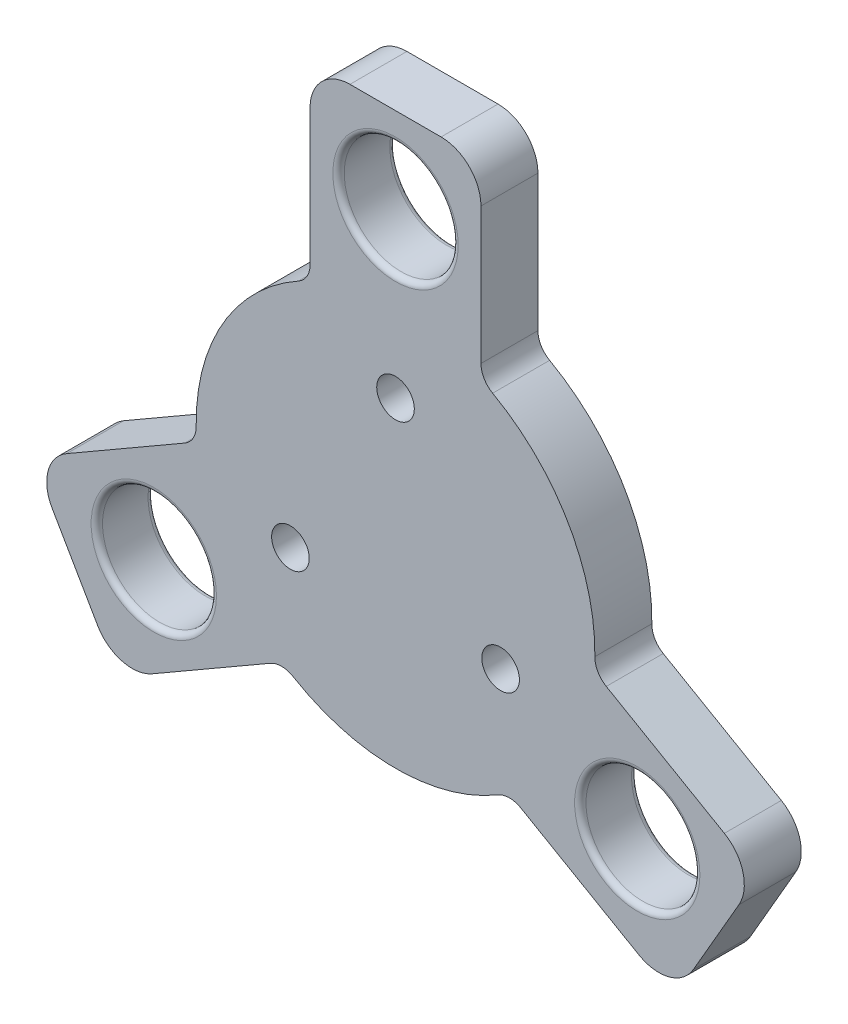
ISO-10303-21;
HEADER;
FILE_DESCRIPTION(('STEP AP214'),'2;1');
FILE_NAME('part.step','',(''),(''),'','','');
FILE_SCHEMA(('AUTOMOTIVE_DESIGN { 1 0 10303 214 1 1 1 1 }'));
ENDSEC;
DATA;
#1=APPLICATION_CONTEXT('core data for automotive mechanical design processes');
#2=APPLICATION_PROTOCOL_DEFINITION('international standard','automotive_design',2000,#1);
#3=PRODUCT_CONTEXT('',#1,'mechanical');
#4=PRODUCT('Part','Part','',(#3));
#5=PRODUCT_RELATED_PRODUCT_CATEGORY('part','',(#4));
#6=PRODUCT_DEFINITION_FORMATION('','',#4);
#7=PRODUCT_DEFINITION_CONTEXT('part definition',#1,'design');
#8=PRODUCT_DEFINITION('design','',#6,#7);
#9=PRODUCT_DEFINITION_SHAPE('','',#8);
#10=(LENGTH_UNIT() NAMED_UNIT(*) SI_UNIT(.MILLI.,.METRE.));
#11=(NAMED_UNIT(*) PLANE_ANGLE_UNIT() SI_UNIT($,.RADIAN.));
#12=(NAMED_UNIT(*) SI_UNIT($,.STERADIAN.) SOLID_ANGLE_UNIT());
#13=UNCERTAINTY_MEASURE_WITH_UNIT(LENGTH_MEASURE(1.E-05),#10,'distance_accuracy_value','');
#14=(GEOMETRIC_REPRESENTATION_CONTEXT(3) GLOBAL_UNCERTAINTY_ASSIGNED_CONTEXT((#13)) GLOBAL_UNIT_ASSIGNED_CONTEXT((#10,
#11,#12)) REPRESENTATION_CONTEXT('',''));
#15=CARTESIAN_POINT('',(0.,0.,0.));
#16=DIRECTION('',(0.,0.,1.));
#17=DIRECTION('',(1.,0.,0.));
#18=AXIS2_PLACEMENT_3D('',#15,#16,#17);
#19=CARTESIAN_POINT('',(3.75000000000002,-6.49519052838328,5.));
#20=DIRECTION('',(-0.500000000000002,0.866025403784437,0.));
#21=DIRECTION('',(-0.866025403784437,-0.500000000000002,0.));
#22=AXIS2_PLACEMENT_3D('',#19,#20,#21);
#23=PLANE('',#22);
#24=DIRECTION('',(0.866025403784437,0.500000000000002,0.));
#25=VECTOR('',#24,1.);
#26=CARTESIAN_POINT('',(3.75000000000002,-6.49519052838328,0.));
#27=LINE('',#26,#25);
#28=CARTESIAN_POINT('',(-21.3647367097487,-20.9951905283834,0.));
#29=VERTEX_POINT('',#28);
#30=CARTESIAN_POINT('',(-10.9978812037526,-15.0098837113465,0.));
#31=VERTEX_POINT('',#30);
#32=EDGE_CURVE('E858',#29,#31,#27,.T.);
#33=ORIENTED_EDGE('',*,*,#32,.T.);
#34=DIRECTION('',(0.,0.,1.));
#35=VECTOR('',#34,1.);
#36=CARTESIAN_POINT('',(-10.9978812037526,-15.0098837113465,5.));
#37=LINE('',#36,#35);
#38=CARTESIAN_POINT('',(-10.9978812037526,-15.0098837113465,5.));
#39=VERTEX_POINT('',#38);
#40=EDGE_CURVE('E352',#31,#39,#37,.T.);
#41=ORIENTED_EDGE('',*,*,#40,.T.);
#42=DIRECTION('',(0.866025403784437,0.500000000000002,0.));
#43=VECTOR('',#42,1.);
#44=CARTESIAN_POINT('',(3.75000000000002,-6.49519052838328,5.));
#45=LINE('',#44,#43);
#46=CARTESIAN_POINT('',(-21.3647367097487,-20.9951905283834,5.));
#47=VERTEX_POINT('',#46);
#48=EDGE_CURVE('E829',#47,#39,#45,.T.);
#49=ORIENTED_EDGE('',*,*,#48,.F.);
#50=DIRECTION('',(0.,0.,-1.));
#51=VECTOR('',#50,1.);
#52=CARTESIAN_POINT('',(-21.3647367097487,-20.9951905283834,5.));
#53=LINE('',#52,#51);
#54=EDGE_CURVE('E313',#47,#29,#53,.T.);
#55=ORIENTED_EDGE('',*,*,#54,.T.);
#56=EDGE_LOOP('',(#33,#41,#49,#55));
#57=FACE_BOUND('',#56,.T.);
#58=ADVANCED_FACE('F47',(#57),#23,.F.);
#59=CARTESIAN_POINT('',(0.,0.,5.));
#60=DIRECTION('',(0.,0.,-1.));
#61=DIRECTION('',(-1.,0.,0.));
#62=AXIS2_PLACEMENT_3D('',#59,#60,#61);
#63=CYLINDRICAL_SURFACE('',#62,17.5);
#64=CARTESIAN_POINT('',(0.,0.,5.));
#65=DIRECTION('',(0.,0.,1.));
#66=DIRECTION('',(1.,0.,0.));
#67=AXIS2_PLACEMENT_3D('',#64,#65,#66);
#68=CIRCLE('',#67,17.5);
#69=CARTESIAN_POINT('',(-8.97245749054719,-15.0248130297959,5.));
#70=VERTEX_POINT('',#69);
#71=CARTESIAN_POINT('',(8.97245749054727,-15.0248130297958,5.));
#72=VERTEX_POINT('',#71);
#73=EDGE_CURVE('E819',#70,#72,#68,.T.);
#74=ORIENTED_EDGE('',*,*,#73,.F.);
#75=DIRECTION('',(0.,0.,-1.));
#76=VECTOR('',#75,1.);
#77=CARTESIAN_POINT('',(-8.97245749054719,-15.0248130297959,5.));
#78=LINE('',#77,#76);
#79=CARTESIAN_POINT('',(-8.97245749054719,-15.0248130297959,0.));
#80=VERTEX_POINT('',#79);
#81=EDGE_CURVE('E348',#70,#80,#78,.T.);
#82=ORIENTED_EDGE('',*,*,#81,.T.);
#83=CARTESIAN_POINT('',(0.,0.,0.));
#84=DIRECTION('',(0.,0.,1.));
#85=DIRECTION('',(1.,0.,0.));
#86=AXIS2_PLACEMENT_3D('',#83,#84,#85);
#87=CIRCLE('',#86,17.5);
#88=CARTESIAN_POINT('',(8.97245749054727,-15.0248130297958,0.));
#89=VERTEX_POINT('',#88);
#90=EDGE_CURVE('E825',#80,#89,#87,.T.);
#91=ORIENTED_EDGE('',*,*,#90,.T.);
#92=DIRECTION('',(0.,0.,-1.));
#93=VECTOR('',#92,1.);
#94=CARTESIAN_POINT('',(8.97245749054727,-15.0248130297958,5.));
#95=LINE('',#94,#93);
#96=EDGE_CURVE('E345',#89,#72,#95,.F.);
#97=ORIENTED_EDGE('',*,*,#96,.T.);
#98=EDGE_LOOP('',(#74,#82,#91,#97));
#99=FACE_BOUND('',#98,.T.);
#100=ADVANCED_FACE('F462',(#99),#63,.T.);
#101=CARTESIAN_POINT('',(-3.74999999999999,-6.49519052838331,5.));
#102=DIRECTION('',(-0.499999999999998,-0.86602540378444,0.));
#103=DIRECTION('',(0.86602540378444,-0.499999999999998,0.));
#104=AXIS2_PLACEMENT_3D('',#101,#102,#103);
#105=PLANE('',#104);
#106=DIRECTION('',(-0.86602540378444,0.499999999999998,0.));
#107=VECTOR('',#106,1.);
#108=CARTESIAN_POINT('',(-3.74999999999999,-6.49519052838331,5.));
#109=LINE('',#108,#107);
#110=CARTESIAN_POINT('',(21.3647367097488,-20.9951905283832,5.));
#111=VERTEX_POINT('',#110);
#112=CARTESIAN_POINT('',(10.9978812037527,-15.0098837113465,5.));
#113=VERTEX_POINT('',#112);
#114=EDGE_CURVE('E812',#111,#113,#109,.T.);
#115=ORIENTED_EDGE('',*,*,#114,.T.);
#116=DIRECTION('',(0.,0.,-1.));
#117=VECTOR('',#116,1.);
#118=CARTESIAN_POINT('',(10.9978812037527,-15.0098837113465,5.));
#119=LINE('',#118,#117);
#120=CARTESIAN_POINT('',(10.9978812037527,-15.0098837113465,0.));
#121=VERTEX_POINT('',#120);
#122=EDGE_CURVE('E355',#113,#121,#119,.T.);
#123=ORIENTED_EDGE('',*,*,#122,.T.);
#124=DIRECTION('',(-0.86602540378444,0.499999999999998,0.));
#125=VECTOR('',#124,1.);
#126=CARTESIAN_POINT('',(-3.74999999999999,-6.49519052838331,0.));
#127=LINE('',#126,#125);
#128=CARTESIAN_POINT('',(21.3647367097488,-20.9951905283832,0.));
#129=VERTEX_POINT('',#128);
#130=EDGE_CURVE('E235',#129,#121,#127,.T.);
#131=ORIENTED_EDGE('',*,*,#130,.F.);
#132=DIRECTION('',(0.,0.,-1.));
#133=VECTOR('',#132,1.);
#134=CARTESIAN_POINT('',(21.3647367097488,-20.9951905283832,5.));
#135=LINE('',#134,#133);
#136=EDGE_CURVE('E266',#129,#111,#135,.F.);
#137=ORIENTED_EDGE('',*,*,#136,.T.);
#138=EDGE_LOOP('',(#115,#123,#131,#137));
#139=FACE_BOUND('',#138,.T.);
#140=ADVANCED_FACE('F469',(#139),#105,.T.);
#141=CARTESIAN_POINT('',(28.1458256229943,-16.2499999999999,5.));
#142=DIRECTION('',(0.86602540378444,-0.499999999999998,0.));
#143=DIRECTION('',(0.499999999999998,0.86602540378444,0.));
#144=AXIS2_PLACEMENT_3D('',#141,#142,#143);
#145=PLANE('',#144);
#146=DIRECTION('',(-0.499999999999998,-0.86602540378444,0.));
#147=VECTOR('',#146,1.);
#148=CARTESIAN_POINT('',(28.1458256229943,-16.2499999999999,5.));
#149=LINE('',#148,#147);
#150=CARTESIAN_POINT('',(30.1458256229943,-12.7858983848622,5.));
#151=VERTEX_POINT('',#150);
#152=CARTESIAN_POINT('',(26.1458256229943,-19.7141016151377,5.));
#153=VERTEX_POINT('',#152);
#154=EDGE_CURVE('E818',#151,#153,#149,.T.);
#155=ORIENTED_EDGE('',*,*,#154,.T.);
#156=DIRECTION('',(0.,0.,-1.));
#157=VECTOR('',#156,1.);
#158=CARTESIAN_POINT('',(26.1458256229943,-19.7141016151377,5.));
#159=LINE('',#158,#157);
#160=CARTESIAN_POINT('',(26.1458256229943,-19.7141016151377,0.));
#161=VERTEX_POINT('',#160);
#162=EDGE_CURVE('E233',#153,#161,#159,.T.);
#163=ORIENTED_EDGE('',*,*,#162,.T.);
#164=DIRECTION('',(-0.499999999999998,-0.86602540378444,0.));
#165=VECTOR('',#164,1.);
#166=CARTESIAN_POINT('',(28.1458256229943,-16.2499999999999,0.));
#167=LINE('',#166,#165);
#168=CARTESIAN_POINT('',(30.1458256229943,-12.7858983848622,0.));
#169=VERTEX_POINT('',#168);
#170=EDGE_CURVE('E215',#169,#161,#167,.T.);
#171=ORIENTED_EDGE('',*,*,#170,.F.);
#172=DIRECTION('',(0.,0.,-1.));
#173=VECTOR('',#172,1.);
#174=CARTESIAN_POINT('',(30.1458256229943,-12.7858983848622,5.));
#175=LINE('',#174,#173);
#176=EDGE_CURVE('E230',#169,#151,#175,.F.);
#177=ORIENTED_EDGE('',*,*,#176,.T.);
#178=EDGE_LOOP('',(#155,#163,#171,#177));
#179=FACE_BOUND('',#178,.T.);
#180=ADVANCED_FACE('F229',(#179),#145,.T.);
#181=CARTESIAN_POINT('',(3.75,6.49519052838331,5.));
#182=DIRECTION('',(-0.499999999999998,-0.86602540378444,0.));
#183=DIRECTION('',(0.86602540378444,-0.499999999999998,0.));
#184=AXIS2_PLACEMENT_3D('',#181,#182,#183);
#185=PLANE('',#184);
#186=DIRECTION('',(-0.86602540378444,0.499999999999998,0.));
#187=VECTOR('',#186,1.);
#188=CARTESIAN_POINT('',(3.75,6.49519052838331,0.));
#189=LINE('',#188,#187);
#190=CARTESIAN_POINT('',(28.8647367097487,-8.00480947161663,0.));
#191=VERTEX_POINT('',#190);
#192=CARTESIAN_POINT('',(18.4978812037526,-2.01950265457985,0.));
#193=VERTEX_POINT('',#192);
#194=EDGE_CURVE('E217',#191,#193,#189,.T.);
#195=ORIENTED_EDGE('',*,*,#194,.T.);
#196=DIRECTION('',(0.,0.,1.));
#197=VECTOR('',#196,1.);
#198=CARTESIAN_POINT('',(18.4978812037526,-2.01950265457985,5.));
#199=LINE('',#198,#197);
#200=CARTESIAN_POINT('',(18.4978812037526,-2.01950265457985,5.));
#201=VERTEX_POINT('',#200);
#202=EDGE_CURVE('E338',#193,#201,#199,.T.);
#203=ORIENTED_EDGE('',*,*,#202,.T.);
#204=DIRECTION('',(-0.86602540378444,0.499999999999998,0.));
#205=VECTOR('',#204,1.);
#206=CARTESIAN_POINT('',(3.75,6.49519052838331,5.));
#207=LINE('',#206,#205);
#208=CARTESIAN_POINT('',(28.8647367097487,-8.00480947161663,5.));
#209=VERTEX_POINT('',#208);
#210=EDGE_CURVE('E838',#209,#201,#207,.T.);
#211=ORIENTED_EDGE('',*,*,#210,.F.);
#212=DIRECTION('',(0.,0.,-1.));
#213=VECTOR('',#212,1.);
#214=CARTESIAN_POINT('',(28.8647367097487,-8.00480947161663,0.));
#215=LINE('',#214,#213);
#216=EDGE_CURVE('E286',#209,#191,#215,.T.);
#217=ORIENTED_EDGE('',*,*,#216,.T.);
#218=EDGE_LOOP('',(#195,#203,#211,#217));
#219=FACE_BOUND('',#218,.T.);
#220=ADVANCED_FACE('F763',(#219),#185,.F.);
#221=CARTESIAN_POINT('',(17.4980985161883,-0.2579696062919,5.));
#222=VERTEX_POINT('',#221);
#223=CARTESIAN_POINT('',(8.52564102564103,15.2827826360878,5.));
#224=VERTEX_POINT('',#223);
#225=EDGE_CURVE('E831',#222,#224,#68,.T.);
#226=ORIENTED_EDGE('',*,*,#225,.F.);
#227=DIRECTION('',(0.,0.,-1.));
#228=VECTOR('',#227,1.);
#229=CARTESIAN_POINT('',(17.4980985161883,-0.2579696062919,5.));
#230=LINE('',#229,#228);
#231=CARTESIAN_POINT('',(17.4980985161883,-0.2579696062919,0.));
#232=VERTEX_POINT('',#231);
#233=EDGE_CURVE('E334',#222,#232,#230,.T.);
#234=ORIENTED_EDGE('',*,*,#233,.T.);
#235=CARTESIAN_POINT('',(8.52564102564103,15.2827826360878,0.));
#236=VERTEX_POINT('',#235);
#237=EDGE_CURVE('E864',#232,#236,#87,.T.);
#238=ORIENTED_EDGE('',*,*,#237,.T.);
#239=DIRECTION('',(0.,0.,-1.));
#240=VECTOR('',#239,1.);
#241=CARTESIAN_POINT('',(8.52564102564103,15.2827826360878,5.));
#242=LINE('',#241,#240);
#243=EDGE_CURVE('E331',#236,#224,#242,.F.);
#244=ORIENTED_EDGE('',*,*,#243,.T.);
#245=EDGE_LOOP('',(#226,#234,#238,#244));
#246=FACE_BOUND('',#245,.T.);
#247=ADVANCED_FACE('F472',(#246),#63,.T.);
#248=CARTESIAN_POINT('',(7.5,0.,5.));
#249=DIRECTION('',(1.,0.,0.));
#250=DIRECTION('',(0.,1.,0.));
#251=AXIS2_PLACEMENT_3D('',#248,#249,#250);
#252=PLANE('',#251);
#253=DIRECTION('',(0.,-1.,0.));
#254=VECTOR('',#253,1.);
#255=CARTESIAN_POINT('',(7.5,0.,5.));
#256=LINE('',#255,#254);
#257=CARTESIAN_POINT('',(7.5,29.,5.));
#258=VERTEX_POINT('',#257);
#259=CARTESIAN_POINT('',(7.5,17.0293863659264,5.));
#260=VERTEX_POINT('',#259);
#261=EDGE_CURVE('E837',#258,#260,#256,.T.);
#262=ORIENTED_EDGE('',*,*,#261,.T.);
#263=DIRECTION('',(0.,0.,-1.));
#264=VECTOR('',#263,1.);
#265=CARTESIAN_POINT('',(7.5,17.0293863659264,5.));
#266=LINE('',#265,#264);
#267=CARTESIAN_POINT('',(7.5,17.0293863659264,0.));
#268=VERTEX_POINT('',#267);
#269=EDGE_CURVE('E341',#260,#268,#266,.T.);
#270=ORIENTED_EDGE('',*,*,#269,.T.);
#271=DIRECTION('',(0.,-1.,0.));
#272=VECTOR('',#271,1.);
#273=CARTESIAN_POINT('',(7.5,0.,0.));
#274=LINE('',#273,#272);
#275=CARTESIAN_POINT('',(7.5,29.,0.));
#276=VERTEX_POINT('',#275);
#277=EDGE_CURVE('E870',#276,#268,#274,.T.);
#278=ORIENTED_EDGE('',*,*,#277,.F.);
#279=DIRECTION('',(0.,0.,-1.));
#280=VECTOR('',#279,1.);
#281=CARTESIAN_POINT('',(7.5,29.,5.));
#282=LINE('',#281,#280);
#283=EDGE_CURVE('E296',#276,#258,#282,.F.);
#284=ORIENTED_EDGE('',*,*,#283,.T.);
#285=EDGE_LOOP('',(#262,#270,#278,#284));
#286=FACE_BOUND('',#285,.T.);
#287=ADVANCED_FACE('F746',(#286),#252,.T.);
#288=CARTESIAN_POINT('',(0.,32.5,5.));
#289=DIRECTION('',(0.,1.,0.));
#290=DIRECTION('',(0.,0.,1.));
#291=AXIS2_PLACEMENT_3D('',#288,#289,#290);
#292=PLANE('',#291);
#293=DIRECTION('',(1.,0.,0.));
#294=VECTOR('',#293,1.);
#295=CARTESIAN_POINT('',(0.,32.5,5.));
#296=LINE('',#295,#294);
#297=CARTESIAN_POINT('',(-4.,32.5,5.));
#298=VERTEX_POINT('',#297);
#299=CARTESIAN_POINT('',(4.,32.5,5.));
#300=VERTEX_POINT('',#299);
#301=EDGE_CURVE('E849',#298,#300,#296,.T.);
#302=ORIENTED_EDGE('',*,*,#301,.T.);
#303=DIRECTION('',(0.,0.,-1.));
#304=VECTOR('',#303,1.);
#305=CARTESIAN_POINT('',(4.,32.5,5.));
#306=LINE('',#305,#304);
#307=CARTESIAN_POINT('',(4.,32.5,0.));
#308=VERTEX_POINT('',#307);
#309=EDGE_CURVE('E292',#300,#308,#306,.T.);
#310=ORIENTED_EDGE('',*,*,#309,.T.);
#311=DIRECTION('',(1.,0.,0.));
#312=VECTOR('',#311,1.);
#313=CARTESIAN_POINT('',(0.,32.5,0.));
#314=LINE('',#313,#312);
#315=CARTESIAN_POINT('',(-4.,32.5,0.));
#316=VERTEX_POINT('',#315);
#317=EDGE_CURVE('E874',#316,#308,#314,.T.);
#318=ORIENTED_EDGE('',*,*,#317,.F.);
#319=DIRECTION('',(0.,0.,-1.));
#320=VECTOR('',#319,1.);
#321=CARTESIAN_POINT('',(-4.,32.5,5.));
#322=LINE('',#321,#320);
#323=EDGE_CURVE('E289',#316,#298,#322,.F.);
#324=ORIENTED_EDGE('',*,*,#323,.T.);
#325=EDGE_LOOP('',(#302,#310,#318,#324));
#326=FACE_BOUND('',#325,.T.);
#327=ADVANCED_FACE('F737',(#326),#292,.T.);
#328=CARTESIAN_POINT('',(-7.5,0.,5.));
#329=DIRECTION('',(1.,0.,0.));
#330=DIRECTION('',(0.,1.,0.));
#331=AXIS2_PLACEMENT_3D('',#328,#329,#330);
#332=PLANE('',#331);
#333=DIRECTION('',(0.,-1.,0.));
#334=VECTOR('',#333,1.);
#335=CARTESIAN_POINT('',(-7.5,0.,0.));
#336=LINE('',#335,#334);
#337=CARTESIAN_POINT('',(-7.5,29.,0.));
#338=VERTEX_POINT('',#337);
#339=CARTESIAN_POINT('',(-7.5,17.0293863659264,0.));
#340=VERTEX_POINT('',#339);
#341=EDGE_CURVE('E878',#338,#340,#336,.T.);
#342=ORIENTED_EDGE('',*,*,#341,.T.);
#343=DIRECTION('',(0.,0.,1.));
#344=VECTOR('',#343,1.);
#345=CARTESIAN_POINT('',(-7.5,17.0293863659264,5.));
#346=LINE('',#345,#344);
#347=CARTESIAN_POINT('',(-7.5,17.0293863659264,5.));
#348=VERTEX_POINT('',#347);
#349=EDGE_CURVE('E328',#340,#348,#346,.T.);
#350=ORIENTED_EDGE('',*,*,#349,.T.);
#351=DIRECTION('',(0.,-1.,0.));
#352=VECTOR('',#351,1.);
#353=CARTESIAN_POINT('',(-7.5,0.,5.));
#354=LINE('',#353,#352);
#355=CARTESIAN_POINT('',(-7.5,29.,5.));
#356=VERTEX_POINT('',#355);
#357=EDGE_CURVE('E841',#356,#348,#354,.T.);
#358=ORIENTED_EDGE('',*,*,#357,.F.);
#359=DIRECTION('',(0.,0.,-1.));
#360=VECTOR('',#359,1.);
#361=CARTESIAN_POINT('',(-7.5,29.,0.));
#362=LINE('',#361,#360);
#363=EDGE_CURVE('E299',#356,#338,#362,.T.);
#364=ORIENTED_EDGE('',*,*,#363,.T.);
#365=EDGE_LOOP('',(#342,#350,#358,#364));
#366=FACE_BOUND('',#365,.T.);
#367=ADVANCED_FACE('F729',(#366),#332,.F.);
#368=CARTESIAN_POINT('',(-8.52564102564103,15.2827826360878,0.));
#369=VERTEX_POINT('',#368);
#370=CARTESIAN_POINT('',(-17.4980985161883,-0.257969606292008,0.));
#371=VERTEX_POINT('',#370);
#372=EDGE_CURVE('E865',#369,#371,#87,.T.);
#373=ORIENTED_EDGE('',*,*,#372,.T.);
#374=DIRECTION('',(0.,0.,-1.));
#375=VECTOR('',#374,1.);
#376=CARTESIAN_POINT('',(-17.4980985161883,-0.257969606292008,5.));
#377=LINE('',#376,#375);
#378=CARTESIAN_POINT('',(-17.4980985161883,-0.257969606292008,5.));
#379=VERTEX_POINT('',#378);
#380=EDGE_CURVE('E325',#371,#379,#377,.F.);
#381=ORIENTED_EDGE('',*,*,#380,.T.);
#382=CARTESIAN_POINT('',(-8.52564102564103,15.2827826360878,5.));
#383=VERTEX_POINT('',#382);
#384=EDGE_CURVE('E832',#383,#379,#68,.T.);
#385=ORIENTED_EDGE('',*,*,#384,.F.);
#386=DIRECTION('',(0.,0.,-1.));
#387=VECTOR('',#386,1.);
#388=CARTESIAN_POINT('',(-8.52564102564103,15.2827826360878,5.));
#389=LINE('',#388,#387);
#390=EDGE_CURVE('E321',#383,#369,#389,.T.);
#391=ORIENTED_EDGE('',*,*,#390,.T.);
#392=EDGE_LOOP('',(#373,#381,#385,#391));
#393=FACE_BOUND('',#392,.T.);
#394=ADVANCED_FACE('F473',(#393),#63,.T.);
#395=CARTESIAN_POINT('',(-3.75000000000001,6.49519052838327,5.));
#396=DIRECTION('',(-0.500000000000002,0.866025403784437,0.));
#397=DIRECTION('',(-0.866025403784437,-0.500000000000002,0.));
#398=AXIS2_PLACEMENT_3D('',#395,#396,#397);
#399=PLANE('',#398);
#400=DIRECTION('',(0.866025403784438,0.500000000000002,0.));
#401=VECTOR('',#400,1.);
#402=CARTESIAN_POINT('',(-3.75000000000001,6.49519052838327,5.));
#403=LINE('',#402,#401);
#404=CARTESIAN_POINT('',(-28.8647367097487,-8.0048094716168,5.));
#405=VERTEX_POINT('',#404);
#406=CARTESIAN_POINT('',(-18.4978812037526,-2.01950265457997,5.));
#407=VERTEX_POINT('',#406);
#408=EDGE_CURVE('E248',#405,#407,#403,.T.);
#409=ORIENTED_EDGE('',*,*,#408,.T.);
#410=DIRECTION('',(0.,0.,-1.));
#411=VECTOR('',#410,1.);
#412=CARTESIAN_POINT('',(-18.4978812037526,-2.01950265457997,5.));
#413=LINE('',#412,#411);
#414=CARTESIAN_POINT('',(-18.4978812037526,-2.01950265457997,0.));
#415=VERTEX_POINT('',#414);
#416=EDGE_CURVE('E317',#407,#415,#413,.T.);
#417=ORIENTED_EDGE('',*,*,#416,.T.);
#418=DIRECTION('',(0.866025403784438,0.500000000000002,0.));
#419=VECTOR('',#418,1.);
#420=CARTESIAN_POINT('',(-3.75000000000001,6.49519052838327,0.));
#421=LINE('',#420,#419);
#422=CARTESIAN_POINT('',(-28.8647367097487,-8.0048094716168,0.));
#423=VERTEX_POINT('',#422);
#424=EDGE_CURVE('E881',#423,#415,#421,.T.);
#425=ORIENTED_EDGE('',*,*,#424,.F.);
#426=DIRECTION('',(0.,0.,-1.));
#427=VECTOR('',#426,1.);
#428=CARTESIAN_POINT('',(-28.8647367097487,-8.00480947161679,5.));
#429=LINE('',#428,#427);
#430=EDGE_CURVE('E310',#423,#405,#429,.F.);
#431=ORIENTED_EDGE('',*,*,#430,.T.);
#432=EDGE_LOOP('',(#409,#417,#425,#431));
#433=FACE_BOUND('',#432,.T.);
#434=ADVANCED_FACE('F713',(#433),#399,.T.);
#435=CARTESIAN_POINT('',(0.,25.,5.));
#436=DIRECTION('',(0.,0.,-1.));
#437=DIRECTION('',(-1.,0.,0.));
#438=AXIS2_PLACEMENT_3D('',#435,#436,#437);
#439=CYLINDRICAL_SURFACE('',#438,5.);
#440=CARTESIAN_POINT('',(0.,25.,0.5));
#441=DIRECTION('',(0.,0.,1.));
#442=DIRECTION('',(1.,0.,0.));
#443=AXIS2_PLACEMENT_3D('',#440,#441,#442);
#444=CIRCLE('',#443,5.);
#445=CARTESIAN_POINT('',(5.,25.,0.5));
#446=VERTEX_POINT('',#445);
#447=EDGE_CURVE('E424',#446,#446,#444,.F.);
#448=ORIENTED_EDGE('',*,*,#447,.T.);
#449=EDGE_LOOP('',(#448));
#450=FACE_BOUND('',#449,.T.);
#451=CARTESIAN_POINT('',(0.,25.,4.5));
#452=DIRECTION('',(0.,0.,1.));
#453=DIRECTION('',(1.,0.,0.));
#454=AXIS2_PLACEMENT_3D('',#451,#452,#453);
#455=CIRCLE('',#454,5.);
#456=CARTESIAN_POINT('',(5.,25.,4.5));
#457=VERTEX_POINT('',#456);
#458=EDGE_CURVE('E420',#457,#457,#455,.T.);
#459=ORIENTED_EDGE('',*,*,#458,.T.);
#460=EDGE_LOOP('',(#459));
#461=FACE_BOUND('',#460,.T.);
#462=ADVANCED_FACE('F704',(#450,#461),#439,.F.);
#463=CARTESIAN_POINT('',(-28.1458256229942,-16.2500000000001,5.));
#464=DIRECTION('',(0.866025403784437,0.500000000000002,0.));
#465=DIRECTION('',(-0.500000000000002,0.866025403784437,0.));
#466=AXIS2_PLACEMENT_3D('',#463,#464,#465);
#467=PLANE('',#466);
#468=DIRECTION('',(0.500000000000002,-0.866025403784437,0.));
#469=VECTOR('',#468,1.);
#470=CARTESIAN_POINT('',(-28.1458256229942,-16.2500000000001,5.));
#471=LINE('',#470,#469);
#472=CARTESIAN_POINT('',(-30.1458256229942,-12.7858983848623,5.));
#473=VERTEX_POINT('',#472);
#474=CARTESIAN_POINT('',(-26.1458256229942,-19.7141016151378,5.));
#475=VERTEX_POINT('',#474);
#476=EDGE_CURVE('E241',#473,#475,#471,.T.);
#477=ORIENTED_EDGE('',*,*,#476,.F.);
#478=DIRECTION('',(0.,0.,-1.));
#479=VECTOR('',#478,1.);
#480=CARTESIAN_POINT('',(-30.1458256229942,-12.7858983848623,0.));
#481=LINE('',#480,#479);
#482=CARTESIAN_POINT('',(-30.1458256229942,-12.7858983848623,0.));
#483=VERTEX_POINT('',#482);
#484=EDGE_CURVE('E306',#473,#483,#481,.T.);
#485=ORIENTED_EDGE('',*,*,#484,.T.);
#486=DIRECTION('',(0.500000000000002,-0.866025403784437,0.));
#487=VECTOR('',#486,1.);
#488=CARTESIAN_POINT('',(-28.1458256229942,-16.2500000000001,0.));
#489=LINE('',#488,#487);
#490=CARTESIAN_POINT('',(-26.1458256229942,-19.7141016151378,0.));
#491=VERTEX_POINT('',#490);
#492=EDGE_CURVE('E251',#483,#491,#489,.T.);
#493=ORIENTED_EDGE('',*,*,#492,.T.);
#494=DIRECTION('',(0.,0.,-1.));
#495=VECTOR('',#494,1.);
#496=CARTESIAN_POINT('',(-26.1458256229942,-19.7141016151378,5.));
#497=LINE('',#496,#495);
#498=EDGE_CURVE('E303',#491,#475,#497,.F.);
#499=ORIENTED_EDGE('',*,*,#498,.T.);
#500=EDGE_LOOP('',(#477,#485,#493,#499));
#501=FACE_BOUND('',#500,.T.);
#502=ADVANCED_FACE('F456',(#501),#467,.F.);
#503=CARTESIAN_POINT('',(-21.2176223927187,-12.2500000000001,5.));
#504=DIRECTION('',(0.,0.,-1.));
#505=DIRECTION('',(-1.,0.,0.));
#506=AXIS2_PLACEMENT_3D('',#503,#504,#505);
#507=CYLINDRICAL_SURFACE('',#506,5.);
#508=CARTESIAN_POINT('',(-21.2176223927187,-12.2500000000001,0.5));
#509=DIRECTION('',(0.,0.,1.));
#510=DIRECTION('',(1.,0.,0.));
#511=AXIS2_PLACEMENT_3D('',#508,#509,#510);
#512=CIRCLE('',#511,5.);
#513=CARTESIAN_POINT('',(-16.2176223927187,-12.2500000000001,0.5));
#514=VERTEX_POINT('',#513);
#515=EDGE_CURVE('E416',#514,#514,#512,.F.);
#516=ORIENTED_EDGE('',*,*,#515,.T.);
#517=EDGE_LOOP('',(#516));
#518=FACE_BOUND('',#517,.T.);
#519=CARTESIAN_POINT('',(-21.2176223927187,-12.2500000000001,4.5));
#520=DIRECTION('',(0.,0.,1.));
#521=DIRECTION('',(1.,0.,0.));
#522=AXIS2_PLACEMENT_3D('',#519,#520,#521);
#523=CIRCLE('',#522,5.);
#524=CARTESIAN_POINT('',(-16.2176223927187,-12.2500000000001,4.5));
#525=VERTEX_POINT('',#524);
#526=EDGE_CURVE('E412',#525,#525,#523,.T.);
#527=ORIENTED_EDGE('',*,*,#526,.T.);
#528=EDGE_LOOP('',(#527));
#529=FACE_BOUND('',#528,.T.);
#530=ADVANCED_FACE('F446',(#518,#529),#507,.F.);
#531=CARTESIAN_POINT('',(21.2176223927188,-12.2499999999999,5.));
#532=DIRECTION('',(0.,0.,-1.));
#533=DIRECTION('',(-1.,0.,0.));
#534=AXIS2_PLACEMENT_3D('',#531,#532,#533);
#535=CYLINDRICAL_SURFACE('',#534,5.);
#536=CARTESIAN_POINT('',(21.2176223927188,-12.2499999999999,0.5));
#537=DIRECTION('',(0.,0.,1.));
#538=DIRECTION('',(1.,0.,0.));
#539=AXIS2_PLACEMENT_3D('',#536,#537,#538);
#540=CIRCLE('',#539,5.);
#541=CARTESIAN_POINT('',(26.2176223927188,-12.2499999999999,0.5));
#542=VERTEX_POINT('',#541);
#543=EDGE_CURVE('E408',#542,#542,#540,.F.);
#544=ORIENTED_EDGE('',*,*,#543,.T.);
#545=EDGE_LOOP('',(#544));
#546=FACE_BOUND('',#545,.T.);
#547=CARTESIAN_POINT('',(21.2176223927188,-12.2499999999999,4.5));
#548=DIRECTION('',(0.,0.,1.));
#549=DIRECTION('',(1.,0.,0.));
#550=AXIS2_PLACEMENT_3D('',#547,#548,#549);
#551=CIRCLE('',#550,5.);
#552=CARTESIAN_POINT('',(26.2176223927188,-12.2499999999999,4.5));
#553=VERTEX_POINT('',#552);
#554=EDGE_CURVE('E404',#553,#553,#551,.T.);
#555=ORIENTED_EDGE('',*,*,#554,.T.);
#556=EDGE_LOOP('',(#555));
#557=FACE_BOUND('',#556,.T.);
#558=ADVANCED_FACE('F444',(#546,#557),#535,.F.);
#559=CARTESIAN_POINT('',(0.,0.,5.));
#560=DIRECTION('',(0.,0.,1.));
#561=DIRECTION('',(1.,0.,0.));
#562=AXIS2_PLACEMENT_3D('',#559,#560,#561);
#563=PLANE('',#562);
#564=CARTESIAN_POINT('',(9.22317055030428,-5.32499999999998,5.));
#565=DIRECTION('',(0.,0.,1.));
#566=DIRECTION('',(1.,0.,0.));
#567=AXIS2_PLACEMENT_3D('',#564,#565,#566);
#568=CIRCLE('',#567,1.65);
#569=CARTESIAN_POINT('',(10.8731705503043,-5.32499999999998,5.));
#570=VERTEX_POINT('',#569);
#571=EDGE_CURVE('E861',#570,#570,#568,.F.);
#572=ORIENTED_EDGE('',*,*,#571,.T.);
#573=EDGE_LOOP('',(#572));
#574=FACE_BOUND('',#573,.T.);
#575=CARTESIAN_POINT('',(-9.22317055030425,-5.32500000000004,5.));
#576=DIRECTION('',(0.,0.,1.));
#577=DIRECTION('',(1.,0.,0.));
#578=AXIS2_PLACEMENT_3D('',#575,#576,#577);
#579=CIRCLE('',#578,1.65000000000001);
#580=CARTESIAN_POINT('',(-7.57317055030424,-5.32500000000004,5.));
#581=VERTEX_POINT('',#580);
#582=EDGE_CURVE('E946',#581,#581,#579,.F.);
#583=ORIENTED_EDGE('',*,*,#582,.T.);
#584=EDGE_LOOP('',(#583));
#585=FACE_BOUND('',#584,.T.);
#586=CARTESIAN_POINT('',(0.,10.65,5.));
#587=DIRECTION('',(0.,0.,1.));
#588=DIRECTION('',(1.,0.,0.));
#589=AXIS2_PLACEMENT_3D('',#586,#587,#588);
#590=CIRCLE('',#589,1.65);
#591=CARTESIAN_POINT('',(1.65,10.65,5.));
#592=VERTEX_POINT('',#591);
#593=EDGE_CURVE('E954',#592,#592,#590,.F.);
#594=ORIENTED_EDGE('',*,*,#593,.T.);
#595=EDGE_LOOP('',(#594));
#596=FACE_BOUND('',#595,.T.);
#597=CARTESIAN_POINT('',(-21.2176223927187,-12.2500000000001,5.));
#598=DIRECTION('',(0.,0.,1.));
#599=DIRECTION('',(1.,0.,0.));
#600=AXIS2_PLACEMENT_3D('',#597,#598,#599);
#601=CIRCLE('',#600,5.50000000000001);
#602=CARTESIAN_POINT('',(-15.7176223927187,-12.2500000000001,5.));
#603=VERTEX_POINT('',#602);
#604=EDGE_CURVE('E11',#603,#603,#601,.F.);
#605=ORIENTED_EDGE('',*,*,#604,.T.);
#606=EDGE_LOOP('',(#605));
#607=FACE_BOUND('',#606,.T.);
#608=CARTESIAN_POINT('',(21.2176223927188,-12.2499999999999,5.));
#609=DIRECTION('',(0.,0.,1.));
#610=DIRECTION('',(1.,0.,0.));
#611=AXIS2_PLACEMENT_3D('',#608,#609,#610);
#612=CIRCLE('',#611,5.5);
#613=CARTESIAN_POINT('',(26.7176223927188,-12.2499999999999,5.));
#614=VERTEX_POINT('',#613);
#615=EDGE_CURVE('E56',#614,#614,#612,.F.);
#616=ORIENTED_EDGE('',*,*,#615,.T.);
#617=EDGE_LOOP('',(#616));
#618=FACE_BOUND('',#617,.T.);
#619=CARTESIAN_POINT('',(0.,25.,5.));
#620=DIRECTION('',(0.,0.,1.));
#621=DIRECTION('',(1.,0.,0.));
#622=AXIS2_PLACEMENT_3D('',#619,#620,#621);
#623=CIRCLE('',#622,5.5);
#624=CARTESIAN_POINT('',(5.5,25.,5.));
#625=VERTEX_POINT('',#624);
#626=EDGE_CURVE('E428',#625,#625,#623,.F.);
#627=ORIENTED_EDGE('',*,*,#626,.T.);
#628=EDGE_LOOP('',(#627));
#629=FACE_BOUND('',#628,.T.);
#630=ORIENTED_EDGE('',*,*,#114,.F.);
#631=CARTESIAN_POINT('',(23.1147367097488,-17.9641016151377,5.));
#632=DIRECTION('',(0.,0.,1.));
#633=DIRECTION('',(1.,0.,0.));
#634=AXIS2_PLACEMENT_3D('',#631,#632,#633);
#635=CIRCLE('',#634,3.5);
#636=EDGE_CURVE('E283',#111,#153,#635,.T.);
#637=ORIENTED_EDGE('',*,*,#636,.T.);
#638=ORIENTED_EDGE('',*,*,#154,.F.);
#639=CARTESIAN_POINT('',(27.1147367097487,-11.0358983848622,5.));
#640=DIRECTION('',(0.,0.,1.));
#641=DIRECTION('',(1.,0.,0.));
#642=AXIS2_PLACEMENT_3D('',#639,#640,#641);
#643=CIRCLE('',#642,3.5);
#644=EDGE_CURVE('E239',#151,#209,#643,.T.);
#645=ORIENTED_EDGE('',*,*,#644,.T.);
#646=ORIENTED_EDGE('',*,*,#210,.T.);
#647=CARTESIAN_POINT('',(19.4978812037526,-0.287451847010975,5.));
#648=DIRECTION('',(0.,0.,1.));
#649=DIRECTION('',(1.,0.,0.));
#650=AXIS2_PLACEMENT_3D('',#647,#648,#649);
#651=CIRCLE('',#650,2.);
#652=EDGE_CURVE('E373',#201,#222,#651,.F.);
#653=ORIENTED_EDGE('',*,*,#652,.T.);
#654=ORIENTED_EDGE('',*,*,#225,.T.);
#655=CARTESIAN_POINT('',(9.5,17.0293863659264,5.));
#656=DIRECTION('',(0.,0.,1.));
#657=DIRECTION('',(1.,0.,0.));
#658=AXIS2_PLACEMENT_3D('',#655,#656,#657);
#659=CIRCLE('',#658,2.);
#660=EDGE_CURVE('E379',#224,#260,#659,.F.);
#661=ORIENTED_EDGE('',*,*,#660,.T.);
#662=ORIENTED_EDGE('',*,*,#261,.F.);
#663=CARTESIAN_POINT('',(4.,29.,5.));
#664=DIRECTION('',(0.,0.,1.));
#665=DIRECTION('',(1.,0.,0.));
#666=AXIS2_PLACEMENT_3D('',#663,#664,#665);
#667=CIRCLE('',#666,3.5);
#668=EDGE_CURVE('E278',#258,#300,#667,.T.);
#669=ORIENTED_EDGE('',*,*,#668,.T.);
#670=ORIENTED_EDGE('',*,*,#301,.F.);
#671=CARTESIAN_POINT('',(-4.,29.,5.));
#672=DIRECTION('',(0.,0.,1.));
#673=DIRECTION('',(1.,0.,0.));
#674=AXIS2_PLACEMENT_3D('',#671,#672,#673);
#675=CIRCLE('',#674,3.5);
#676=EDGE_CURVE('E275',#298,#356,#675,.T.);
#677=ORIENTED_EDGE('',*,*,#676,.T.);
#678=ORIENTED_EDGE('',*,*,#357,.T.);
#679=CARTESIAN_POINT('',(-9.5,17.0293863659264,5.));
#680=DIRECTION('',(0.,0.,1.));
#681=DIRECTION('',(1.,0.,0.));
#682=AXIS2_PLACEMENT_3D('',#679,#680,#681);
#683=CIRCLE('',#682,2.);
#684=EDGE_CURVE('E367',#348,#383,#683,.F.);
#685=ORIENTED_EDGE('',*,*,#684,.T.);
#686=ORIENTED_EDGE('',*,*,#384,.T.);
#687=CARTESIAN_POINT('',(-19.4978812037526,-0.287451847011094,5.));
#688=DIRECTION('',(0.,0.,1.));
#689=DIRECTION('',(1.,0.,0.));
#690=AXIS2_PLACEMENT_3D('',#687,#688,#689);
#691=CIRCLE('',#690,2.);
#692=EDGE_CURVE('E361',#379,#407,#691,.F.);
#693=ORIENTED_EDGE('',*,*,#692,.T.);
#694=ORIENTED_EDGE('',*,*,#408,.F.);
#695=CARTESIAN_POINT('',(-27.1147367097487,-11.0358983848623,5.));
#696=DIRECTION('',(0.,0.,1.));
#697=DIRECTION('',(1.,0.,0.));
#698=AXIS2_PLACEMENT_3D('',#695,#696,#697);
#699=CIRCLE('',#698,3.5);
#700=EDGE_CURVE('E272',#405,#473,#699,.T.);
#701=ORIENTED_EDGE('',*,*,#700,.T.);
#702=ORIENTED_EDGE('',*,*,#476,.T.);
#703=CARTESIAN_POINT('',(-23.1147367097487,-17.9641016151378,5.));
#704=DIRECTION('',(0.,0.,1.));
#705=DIRECTION('',(1.,0.,0.));
#706=AXIS2_PLACEMENT_3D('',#703,#704,#705);
#707=CIRCLE('',#706,3.5);
#708=EDGE_CURVE('E269',#475,#47,#707,.T.);
#709=ORIENTED_EDGE('',*,*,#708,.T.);
#710=ORIENTED_EDGE('',*,*,#48,.T.);
#711=CARTESIAN_POINT('',(-9.99788120375258,-16.7419345189154,5.));
#712=DIRECTION('',(0.,0.,1.));
#713=DIRECTION('',(1.,0.,0.));
#714=AXIS2_PLACEMENT_3D('',#711,#712,#713);
#715=CIRCLE('',#714,2.);
#716=EDGE_CURVE('E385',#39,#70,#715,.F.);
#717=ORIENTED_EDGE('',*,*,#716,.T.);
#718=ORIENTED_EDGE('',*,*,#73,.T.);
#719=CARTESIAN_POINT('',(9.99788120375267,-16.7419345189153,5.));
#720=DIRECTION('',(0.,0.,1.));
#721=DIRECTION('',(1.,0.,0.));
#722=AXIS2_PLACEMENT_3D('',#719,#720,#721);
#723=CIRCLE('',#722,2.);
#724=EDGE_CURVE('E63',#72,#113,#723,.F.);
#725=ORIENTED_EDGE('',*,*,#724,.T.);
#726=EDGE_LOOP('',(#630,#637,#638,#645,#646,#653,#654,#661,#662,#669,#670,#677,#678,#685,#686,
#693,#694,#701,#702,#709,#710,#717,#718,#725));
#727=FACE_BOUND('',#726,.T.);
#728=ADVANCED_FACE('F435',(#574,#585,#596,#607,#618,#629,#727),#563,.T.);
#729=CARTESIAN_POINT('',(0.,0.,0.));
#730=DIRECTION('',(0.,0.,1.));
#731=DIRECTION('',(1.,0.,0.));
#732=AXIS2_PLACEMENT_3D('',#729,#730,#731);
#733=PLANE('',#732);
#734=CARTESIAN_POINT('',(9.22317055030428,-5.32499999999998,0.));
#735=DIRECTION('',(0.,0.,-1.));
#736=DIRECTION('',(-1.,0.,0.));
#737=AXIS2_PLACEMENT_3D('',#734,#735,#736);
#738=CIRCLE('',#737,1.65);
#739=CARTESIAN_POINT('',(7.57317055030428,-5.32499999999998,0.));
#740=VERTEX_POINT('',#739);
#741=EDGE_CURVE('E938',#740,#740,#738,.T.);
#742=ORIENTED_EDGE('',*,*,#741,.F.);
#743=EDGE_LOOP('',(#742));
#744=FACE_BOUND('',#743,.T.);
#745=CARTESIAN_POINT('',(-9.22317055030425,-5.32500000000004,0.));
#746=DIRECTION('',(0.,0.,-1.));
#747=DIRECTION('',(-1.,0.,0.));
#748=AXIS2_PLACEMENT_3D('',#745,#746,#747);
#749=CIRCLE('',#748,1.65000000000001);
#750=CARTESIAN_POINT('',(-10.8731705503043,-5.32500000000004,0.));
#751=VERTEX_POINT('',#750);
#752=EDGE_CURVE('E942',#751,#751,#749,.T.);
#753=ORIENTED_EDGE('',*,*,#752,.F.);
#754=EDGE_LOOP('',(#753));
#755=FACE_BOUND('',#754,.T.);
#756=CARTESIAN_POINT('',(0.,10.65,0.));
#757=DIRECTION('',(0.,0.,-1.));
#758=DIRECTION('',(-1.,0.,0.));
#759=AXIS2_PLACEMENT_3D('',#756,#757,#758);
#760=CIRCLE('',#759,1.65);
#761=CARTESIAN_POINT('',(-1.65,10.65,0.));
#762=VERTEX_POINT('',#761);
#763=EDGE_CURVE('E950',#762,#762,#760,.T.);
#764=ORIENTED_EDGE('',*,*,#763,.F.);
#765=EDGE_LOOP('',(#764));
#766=FACE_BOUND('',#765,.T.);
#767=CARTESIAN_POINT('',(21.2176223927188,-12.2499999999999,0.));
#768=DIRECTION('',(0.,0.,1.));
#769=DIRECTION('',(1.,0.,0.));
#770=AXIS2_PLACEMENT_3D('',#767,#768,#769);
#771=CIRCLE('',#770,5.5);
#772=CARTESIAN_POINT('',(26.7176223927188,-12.2499999999999,0.));
#773=VERTEX_POINT('',#772);
#774=EDGE_CURVE('E400',#773,#773,#771,.T.);
#775=ORIENTED_EDGE('',*,*,#774,.T.);
#776=EDGE_LOOP('',(#775));
#777=FACE_BOUND('',#776,.T.);
#778=CARTESIAN_POINT('',(-21.2176223927187,-12.2500000000001,0.));
#779=DIRECTION('',(0.,0.,1.));
#780=DIRECTION('',(1.,0.,0.));
#781=AXIS2_PLACEMENT_3D('',#778,#779,#780);
#782=CIRCLE('',#781,5.50000000000001);
#783=CARTESIAN_POINT('',(-15.7176223927187,-12.2500000000001,0.));
#784=VERTEX_POINT('',#783);
#785=EDGE_CURVE('E396',#784,#784,#782,.T.);
#786=ORIENTED_EDGE('',*,*,#785,.T.);
#787=EDGE_LOOP('',(#786));
#788=FACE_BOUND('',#787,.T.);
#789=CARTESIAN_POINT('',(0.,25.,0.));
#790=DIRECTION('',(0.,0.,1.));
#791=DIRECTION('',(1.,0.,0.));
#792=AXIS2_PLACEMENT_3D('',#789,#790,#791);
#793=CIRCLE('',#792,5.5);
#794=CARTESIAN_POINT('',(5.5,25.,0.));
#795=VERTEX_POINT('',#794);
#796=EDGE_CURVE('E392',#795,#795,#793,.T.);
#797=ORIENTED_EDGE('',*,*,#796,.T.);
#798=EDGE_LOOP('',(#797));
#799=FACE_BOUND('',#798,.T.);
#800=ORIENTED_EDGE('',*,*,#170,.T.);
#801=CARTESIAN_POINT('',(23.1147367097488,-17.9641016151377,0.));
#802=DIRECTION('',(0.,0.,1.));
#803=DIRECTION('',(1.,0.,0.));
#804=AXIS2_PLACEMENT_3D('',#801,#802,#803);
#805=CIRCLE('',#804,3.5);
#806=EDGE_CURVE('E223',#161,#129,#805,.F.);
#807=ORIENTED_EDGE('',*,*,#806,.T.);
#808=ORIENTED_EDGE('',*,*,#130,.T.);
#809=CARTESIAN_POINT('',(9.99788120375267,-16.7419345189153,0.));
#810=DIRECTION('',(0.,0.,1.));
#811=DIRECTION('',(1.,0.,0.));
#812=AXIS2_PLACEMENT_3D('',#809,#810,#811);
#813=CIRCLE('',#812,2.);
#814=EDGE_CURVE('E71',#121,#89,#813,.T.);
#815=ORIENTED_EDGE('',*,*,#814,.T.);
#816=ORIENTED_EDGE('',*,*,#90,.F.);
#817=CARTESIAN_POINT('',(-9.99788120375258,-16.7419345189154,0.));
#818=DIRECTION('',(0.,0.,1.));
#819=DIRECTION('',(1.,0.,0.));
#820=AXIS2_PLACEMENT_3D('',#817,#818,#819);
#821=CIRCLE('',#820,2.);
#822=EDGE_CURVE('E382',#80,#31,#821,.T.);
#823=ORIENTED_EDGE('',*,*,#822,.T.);
#824=ORIENTED_EDGE('',*,*,#32,.F.);
#825=CARTESIAN_POINT('',(-23.1147367097487,-17.9641016151378,0.));
#826=DIRECTION('',(0.,0.,1.));
#827=DIRECTION('',(1.,0.,0.));
#828=AXIS2_PLACEMENT_3D('',#825,#826,#827);
#829=CIRCLE('',#828,3.5);
#830=EDGE_CURVE('E245',#29,#491,#829,.F.);
#831=ORIENTED_EDGE('',*,*,#830,.T.);
#832=ORIENTED_EDGE('',*,*,#492,.F.);
#833=CARTESIAN_POINT('',(-27.1147367097487,-11.0358983848623,0.));
#834=DIRECTION('',(0.,0.,1.));
#835=DIRECTION('',(1.,0.,0.));
#836=AXIS2_PLACEMENT_3D('',#833,#834,#835);
#837=CIRCLE('',#836,3.5);
#838=EDGE_CURVE('E256',#483,#423,#837,.F.);
#839=ORIENTED_EDGE('',*,*,#838,.T.);
#840=ORIENTED_EDGE('',*,*,#424,.T.);
#841=CARTESIAN_POINT('',(-19.4978812037526,-0.287451847011094,0.));
#842=DIRECTION('',(0.,0.,1.));
#843=DIRECTION('',(1.,0.,0.));
#844=AXIS2_PLACEMENT_3D('',#841,#842,#843);
#845=CIRCLE('',#844,2.);
#846=EDGE_CURVE('E358',#415,#371,#845,.T.);
#847=ORIENTED_EDGE('',*,*,#846,.T.);
#848=ORIENTED_EDGE('',*,*,#372,.F.);
#849=CARTESIAN_POINT('',(-9.5,17.0293863659264,0.));
#850=DIRECTION('',(0.,0.,1.));
#851=DIRECTION('',(1.,0.,0.));
#852=AXIS2_PLACEMENT_3D('',#849,#850,#851);
#853=CIRCLE('',#852,2.);
#854=EDGE_CURVE('E364',#369,#340,#853,.T.);
#855=ORIENTED_EDGE('',*,*,#854,.T.);
#856=ORIENTED_EDGE('',*,*,#341,.F.);
#857=CARTESIAN_POINT('',(-4.,29.,0.));
#858=DIRECTION('',(0.,0.,1.));
#859=DIRECTION('',(1.,0.,0.));
#860=AXIS2_PLACEMENT_3D('',#857,#858,#859);
#861=CIRCLE('',#860,3.5);
#862=EDGE_CURVE('E259',#338,#316,#861,.F.);
#863=ORIENTED_EDGE('',*,*,#862,.T.);
#864=ORIENTED_EDGE('',*,*,#317,.T.);
#865=CARTESIAN_POINT('',(4.,29.,0.));
#866=DIRECTION('',(0.,0.,1.));
#867=DIRECTION('',(1.,0.,0.));
#868=AXIS2_PLACEMENT_3D('',#865,#866,#867);
#869=CIRCLE('',#868,3.5);
#870=EDGE_CURVE('E224',#308,#276,#869,.F.);
#871=ORIENTED_EDGE('',*,*,#870,.T.);
#872=ORIENTED_EDGE('',*,*,#277,.T.);
#873=CARTESIAN_POINT('',(9.5,17.0293863659264,0.));
#874=DIRECTION('',(0.,0.,1.));
#875=DIRECTION('',(1.,0.,0.));
#876=AXIS2_PLACEMENT_3D('',#873,#874,#875);
#877=CIRCLE('',#876,2.);
#878=EDGE_CURVE('E376',#268,#236,#877,.T.);
#879=ORIENTED_EDGE('',*,*,#878,.T.);
#880=ORIENTED_EDGE('',*,*,#237,.F.);
#881=CARTESIAN_POINT('',(19.4978812037526,-0.287451847010975,0.));
#882=DIRECTION('',(0.,0.,1.));
#883=DIRECTION('',(1.,0.,0.));
#884=AXIS2_PLACEMENT_3D('',#881,#882,#883);
#885=CIRCLE('',#884,2.);
#886=EDGE_CURVE('E370',#232,#193,#885,.T.);
#887=ORIENTED_EDGE('',*,*,#886,.T.);
#888=ORIENTED_EDGE('',*,*,#194,.F.);
#889=CARTESIAN_POINT('',(27.1147367097487,-11.0358983848622,0.));
#890=DIRECTION('',(0.,0.,1.));
#891=DIRECTION('',(1.,0.,0.));
#892=AXIS2_PLACEMENT_3D('',#889,#890,#891);
#893=CIRCLE('',#892,3.5);
#894=EDGE_CURVE('E212',#191,#169,#893,.F.);
#895=ORIENTED_EDGE('',*,*,#894,.T.);
#896=EDGE_LOOP('',(#800,#807,#808,#815,#816,#823,#824,#831,#832,#839,#840,#847,#848,#855,#856,
#863,#864,#871,#872,#879,#880,#887,#888,#895));
#897=FACE_BOUND('',#896,.T.);
#898=ADVANCED_FACE('F214',(#744,#755,#766,#777,#788,#799,#897),#733,.F.);
#899=CARTESIAN_POINT('',(23.1147367097488,-17.9641016151377,5.));
#900=DIRECTION('',(0.,0.,-1.));
#901=DIRECTION('',(-1.,0.,0.));
#902=AXIS2_PLACEMENT_3D('',#899,#900,#901);
#903=CYLINDRICAL_SURFACE('',#902,3.5);
#904=ORIENTED_EDGE('',*,*,#636,.F.);
#905=ORIENTED_EDGE('',*,*,#136,.F.);
#906=ORIENTED_EDGE('',*,*,#806,.F.);
#907=ORIENTED_EDGE('',*,*,#162,.F.);
#908=EDGE_LOOP('',(#904,#905,#906,#907));
#909=FACE_BOUND('',#908,.T.);
#910=ADVANCED_FACE('F478',(#909),#903,.T.);
#911=CARTESIAN_POINT('',(27.1147367097487,-11.0358983848622,5.));
#912=DIRECTION('',(0.,0.,1.));
#913=DIRECTION('',(1.,0.,0.));
#914=AXIS2_PLACEMENT_3D('',#911,#912,#913);
#915=CYLINDRICAL_SURFACE('',#914,3.5);
#916=ORIENTED_EDGE('',*,*,#644,.F.);
#917=ORIENTED_EDGE('',*,*,#176,.F.);
#918=ORIENTED_EDGE('',*,*,#894,.F.);
#919=ORIENTED_EDGE('',*,*,#216,.F.);
#920=EDGE_LOOP('',(#916,#917,#918,#919));
#921=FACE_BOUND('',#920,.T.);
#922=ADVANCED_FACE('F238',(#921),#915,.T.);
#923=CARTESIAN_POINT('',(4.,29.,5.));
#924=DIRECTION('',(0.,0.,-1.));
#925=DIRECTION('',(-1.,0.,0.));
#926=AXIS2_PLACEMENT_3D('',#923,#924,#925);
#927=CYLINDRICAL_SURFACE('',#926,3.5);
#928=ORIENTED_EDGE('',*,*,#668,.F.);
#929=ORIENTED_EDGE('',*,*,#283,.F.);
#930=ORIENTED_EDGE('',*,*,#870,.F.);
#931=ORIENTED_EDGE('',*,*,#309,.F.);
#932=EDGE_LOOP('',(#928,#929,#930,#931));
#933=FACE_BOUND('',#932,.T.);
#934=ADVANCED_FACE('F484',(#933),#927,.T.);
#935=CARTESIAN_POINT('',(-4.,29.,5.));
#936=DIRECTION('',(0.,0.,1.));
#937=DIRECTION('',(1.,0.,0.));
#938=AXIS2_PLACEMENT_3D('',#935,#936,#937);
#939=CYLINDRICAL_SURFACE('',#938,3.5);
#940=ORIENTED_EDGE('',*,*,#676,.F.);
#941=ORIENTED_EDGE('',*,*,#323,.F.);
#942=ORIENTED_EDGE('',*,*,#862,.F.);
#943=ORIENTED_EDGE('',*,*,#363,.F.);
#944=EDGE_LOOP('',(#940,#941,#942,#943));
#945=FACE_BOUND('',#944,.T.);
#946=ADVANCED_FACE('F487',(#945),#939,.T.);
#947=CARTESIAN_POINT('',(-27.1147367097487,-11.0358983848623,5.));
#948=DIRECTION('',(0.,0.,1.));
#949=DIRECTION('',(1.,0.,0.));
#950=AXIS2_PLACEMENT_3D('',#947,#948,#949);
#951=CYLINDRICAL_SURFACE('',#950,3.5);
#952=ORIENTED_EDGE('',*,*,#700,.F.);
#953=ORIENTED_EDGE('',*,*,#430,.F.);
#954=ORIENTED_EDGE('',*,*,#838,.F.);
#955=ORIENTED_EDGE('',*,*,#484,.F.);
#956=EDGE_LOOP('',(#952,#953,#954,#955));
#957=FACE_BOUND('',#956,.T.);
#958=ADVANCED_FACE('F491',(#957),#951,.T.);
#959=CARTESIAN_POINT('',(-23.1147367097487,-17.9641016151378,5.));
#960=DIRECTION('',(0.,0.,-1.));
#961=DIRECTION('',(-1.,0.,0.));
#962=AXIS2_PLACEMENT_3D('',#959,#960,#961);
#963=CYLINDRICAL_SURFACE('',#962,3.5);
#964=ORIENTED_EDGE('',*,*,#708,.F.);
#965=ORIENTED_EDGE('',*,*,#498,.F.);
#966=ORIENTED_EDGE('',*,*,#830,.F.);
#967=ORIENTED_EDGE('',*,*,#54,.F.);
#968=EDGE_LOOP('',(#964,#965,#966,#967));
#969=FACE_BOUND('',#968,.T.);
#970=ADVANCED_FACE('F495',(#969),#963,.T.);
#971=CARTESIAN_POINT('',(-19.4978812037526,-0.287451847011094,5.));
#972=DIRECTION('',(0.,0.,-1.));
#973=DIRECTION('',(-1.,0.,0.));
#974=AXIS2_PLACEMENT_3D('',#971,#972,#973);
#975=CYLINDRICAL_SURFACE('',#974,2.);
#976=ORIENTED_EDGE('',*,*,#692,.F.);
#977=ORIENTED_EDGE('',*,*,#380,.F.);
#978=ORIENTED_EDGE('',*,*,#846,.F.);
#979=ORIENTED_EDGE('',*,*,#416,.F.);
#980=EDGE_LOOP('',(#976,#977,#978,#979));
#981=FACE_BOUND('',#980,.T.);
#982=ADVANCED_FACE('F498',(#981),#975,.F.);
#983=CARTESIAN_POINT('',(-9.5,17.0293863659264,5.));
#984=DIRECTION('',(0.,0.,-1.));
#985=DIRECTION('',(-1.,0.,0.));
#986=AXIS2_PLACEMENT_3D('',#983,#984,#985);
#987=CYLINDRICAL_SURFACE('',#986,2.);
#988=ORIENTED_EDGE('',*,*,#684,.F.);
#989=ORIENTED_EDGE('',*,*,#349,.F.);
#990=ORIENTED_EDGE('',*,*,#854,.F.);
#991=ORIENTED_EDGE('',*,*,#390,.F.);
#992=EDGE_LOOP('',(#988,#989,#990,#991));
#993=FACE_BOUND('',#992,.T.);
#994=ADVANCED_FACE('F502',(#993),#987,.F.);
#995=CARTESIAN_POINT('',(19.4978812037526,-0.287451847010975,5.));
#996=DIRECTION('',(0.,0.,-1.));
#997=DIRECTION('',(-1.,0.,0.));
#998=AXIS2_PLACEMENT_3D('',#995,#996,#997);
#999=CYLINDRICAL_SURFACE('',#998,2.);
#1000=ORIENTED_EDGE('',*,*,#652,.F.);
#1001=ORIENTED_EDGE('',*,*,#202,.F.);
#1002=ORIENTED_EDGE('',*,*,#886,.F.);
#1003=ORIENTED_EDGE('',*,*,#233,.F.);
#1004=EDGE_LOOP('',(#1000,#1001,#1002,#1003));
#1005=FACE_BOUND('',#1004,.T.);
#1006=ADVANCED_FACE('F506',(#1005),#999,.F.);
#1007=CARTESIAN_POINT('',(9.5,17.0293863659264,5.));
#1008=DIRECTION('',(0.,0.,-1.));
#1009=DIRECTION('',(-1.,0.,0.));
#1010=AXIS2_PLACEMENT_3D('',#1007,#1008,#1009);
#1011=CYLINDRICAL_SURFACE('',#1010,2.);
#1012=ORIENTED_EDGE('',*,*,#660,.F.);
#1013=ORIENTED_EDGE('',*,*,#243,.F.);
#1014=ORIENTED_EDGE('',*,*,#878,.F.);
#1015=ORIENTED_EDGE('',*,*,#269,.F.);
#1016=EDGE_LOOP('',(#1012,#1013,#1014,#1015));
#1017=FACE_BOUND('',#1016,.T.);
#1018=ADVANCED_FACE('F510',(#1017),#1011,.F.);
#1019=CARTESIAN_POINT('',(-9.99788120375258,-16.7419345189154,5.));
#1020=DIRECTION('',(0.,0.,-1.));
#1021=DIRECTION('',(-1.,0.,0.));
#1022=AXIS2_PLACEMENT_3D('',#1019,#1020,#1021);
#1023=CYLINDRICAL_SURFACE('',#1022,2.);
#1024=ORIENTED_EDGE('',*,*,#716,.F.);
#1025=ORIENTED_EDGE('',*,*,#40,.F.);
#1026=ORIENTED_EDGE('',*,*,#822,.F.);
#1027=ORIENTED_EDGE('',*,*,#81,.F.);
#1028=EDGE_LOOP('',(#1024,#1025,#1026,#1027));
#1029=FACE_BOUND('',#1028,.T.);
#1030=ADVANCED_FACE('F514',(#1029),#1023,.F.);
#1031=CARTESIAN_POINT('',(9.99788120375267,-16.7419345189153,5.));
#1032=DIRECTION('',(0.,0.,-1.));
#1033=DIRECTION('',(-1.,0.,0.));
#1034=AXIS2_PLACEMENT_3D('',#1031,#1032,#1033);
#1035=CYLINDRICAL_SURFACE('',#1034,2.);
#1036=ORIENTED_EDGE('',*,*,#724,.F.);
#1037=ORIENTED_EDGE('',*,*,#96,.F.);
#1038=ORIENTED_EDGE('',*,*,#814,.F.);
#1039=ORIENTED_EDGE('',*,*,#122,.F.);
#1040=EDGE_LOOP('',(#1036,#1037,#1038,#1039));
#1041=FACE_BOUND('',#1040,.T.);
#1042=ADVANCED_FACE('F518',(#1041),#1035,.F.);
#1043=CARTESIAN_POINT('',(21.2176223927188,-12.2499999999999,0.5));
#1044=DIRECTION('',(0.,0.,1.));
#1045=DIRECTION('',(1.,0.,0.));
#1046=AXIS2_PLACEMENT_3D('',#1043,#1044,#1045);
#1047=TOROIDAL_SURFACE('',#1046,5.5,0.5);
#1048=ORIENTED_EDGE('',*,*,#543,.F.);
#1049=EDGE_LOOP('',(#1048));
#1050=FACE_BOUND('',#1049,.T.);
#1051=ORIENTED_EDGE('',*,*,#774,.F.);
#1052=EDGE_LOOP('',(#1051));
#1053=FACE_BOUND('',#1052,.T.);
#1054=ADVANCED_FACE('F522',(#1050,#1053),#1047,.T.);
#1055=CARTESIAN_POINT('',(-21.2176223927187,-12.2500000000001,0.5));
#1056=DIRECTION('',(0.,0.,1.));
#1057=DIRECTION('',(1.,0.,0.));
#1058=AXIS2_PLACEMENT_3D('',#1055,#1056,#1057);
#1059=TOROIDAL_SURFACE('',#1058,5.50000000000001,0.5);
#1060=ORIENTED_EDGE('',*,*,#515,.F.);
#1061=EDGE_LOOP('',(#1060));
#1062=FACE_BOUND('',#1061,.T.);
#1063=ORIENTED_EDGE('',*,*,#785,.F.);
#1064=EDGE_LOOP('',(#1063));
#1065=FACE_BOUND('',#1064,.T.);
#1066=ADVANCED_FACE('F524',(#1062,#1065),#1059,.T.);
#1067=CARTESIAN_POINT('',(0.,25.,0.5));
#1068=DIRECTION('',(0.,0.,1.));
#1069=DIRECTION('',(1.,0.,0.));
#1070=AXIS2_PLACEMENT_3D('',#1067,#1068,#1069);
#1071=TOROIDAL_SURFACE('',#1070,5.5,0.5);
#1072=ORIENTED_EDGE('',*,*,#447,.F.);
#1073=EDGE_LOOP('',(#1072));
#1074=FACE_BOUND('',#1073,.T.);
#1075=ORIENTED_EDGE('',*,*,#796,.F.);
#1076=EDGE_LOOP('',(#1075));
#1077=FACE_BOUND('',#1076,.T.);
#1078=ADVANCED_FACE('F528',(#1074,#1077),#1071,.T.);
#1079=CARTESIAN_POINT('',(-21.2176223927187,-12.2500000000001,4.5));
#1080=DIRECTION('',(0.,0.,1.));
#1081=DIRECTION('',(1.,0.,0.));
#1082=AXIS2_PLACEMENT_3D('',#1079,#1080,#1081);
#1083=TOROIDAL_SURFACE('',#1082,5.50000000000001,0.5);
#1084=ORIENTED_EDGE('',*,*,#604,.F.);
#1085=EDGE_LOOP('',(#1084));
#1086=FACE_BOUND('',#1085,.T.);
#1087=ORIENTED_EDGE('',*,*,#526,.F.);
#1088=EDGE_LOOP('',(#1087));
#1089=FACE_BOUND('',#1088,.T.);
#1090=ADVANCED_FACE('F441',(#1086,#1089),#1083,.T.);
#1091=CARTESIAN_POINT('',(21.2176223927188,-12.2499999999999,4.5));
#1092=DIRECTION('',(0.,0.,1.));
#1093=DIRECTION('',(1.,0.,0.));
#1094=AXIS2_PLACEMENT_3D('',#1091,#1092,#1093);
#1095=TOROIDAL_SURFACE('',#1094,5.5,0.5);
#1096=ORIENTED_EDGE('',*,*,#615,.F.);
#1097=EDGE_LOOP('',(#1096));
#1098=FACE_BOUND('',#1097,.T.);
#1099=ORIENTED_EDGE('',*,*,#554,.F.);
#1100=EDGE_LOOP('',(#1099));
#1101=FACE_BOUND('',#1100,.T.);
#1102=ADVANCED_FACE('F438',(#1098,#1101),#1095,.T.);
#1103=CARTESIAN_POINT('',(0.,25.,4.5));
#1104=DIRECTION('',(0.,0.,1.));
#1105=DIRECTION('',(1.,0.,0.));
#1106=AXIS2_PLACEMENT_3D('',#1103,#1104,#1105);
#1107=TOROIDAL_SURFACE('',#1106,5.5,0.5);
#1108=ORIENTED_EDGE('',*,*,#626,.F.);
#1109=EDGE_LOOP('',(#1108));
#1110=FACE_BOUND('',#1109,.T.);
#1111=ORIENTED_EDGE('',*,*,#458,.F.);
#1112=EDGE_LOOP('',(#1111));
#1113=FACE_BOUND('',#1112,.T.);
#1114=ADVANCED_FACE('F49',(#1110,#1113),#1107,.T.);
#1115=CARTESIAN_POINT('',(0.,10.65,9.66690475583123));
#1116=DIRECTION('',(0.,0.,-1.));
#1117=DIRECTION('',(-1.,0.,0.));
#1118=AXIS2_PLACEMENT_3D('',#1115,#1116,#1117);
#1119=CYLINDRICAL_SURFACE('',#1118,1.65);
#1120=ORIENTED_EDGE('',*,*,#763,.T.);
#1121=EDGE_LOOP('',(#1120));
#1122=FACE_BOUND('',#1121,.T.);
#1123=ORIENTED_EDGE('',*,*,#593,.F.);
#1124=EDGE_LOOP('',(#1123));
#1125=FACE_BOUND('',#1124,.T.);
#1126=ADVANCED_FACE('F555',(#1122,#1125),#1119,.F.);
#1127=CARTESIAN_POINT('',(-9.22317055030425,-5.32500000000004,9.66690475583123));
#1128=DIRECTION('',(0.,0.,-1.));
#1129=DIRECTION('',(-1.,0.,0.));
#1130=AXIS2_PLACEMENT_3D('',#1127,#1128,#1129);
#1131=CYLINDRICAL_SURFACE('',#1130,1.65000000000001);
#1132=ORIENTED_EDGE('',*,*,#752,.T.);
#1133=EDGE_LOOP('',(#1132));
#1134=FACE_BOUND('',#1133,.T.);
#1135=ORIENTED_EDGE('',*,*,#582,.F.);
#1136=EDGE_LOOP('',(#1135));
#1137=FACE_BOUND('',#1136,.T.);
#1138=ADVANCED_FACE('F578',(#1134,#1137),#1131,.F.);
#1139=CARTESIAN_POINT('',(9.22317055030428,-5.32499999999998,9.66690475583123));
#1140=DIRECTION('',(0.,0.,-1.));
#1141=DIRECTION('',(-1.,0.,0.));
#1142=AXIS2_PLACEMENT_3D('',#1139,#1140,#1141);
#1143=CYLINDRICAL_SURFACE('',#1142,1.65);
#1144=ORIENTED_EDGE('',*,*,#741,.T.);
#1145=EDGE_LOOP('',(#1144));
#1146=FACE_BOUND('',#1145,.T.);
#1147=ORIENTED_EDGE('',*,*,#571,.F.);
#1148=EDGE_LOOP('',(#1147));
#1149=FACE_BOUND('',#1148,.T.);
#1150=ADVANCED_FACE('F587',(#1146,#1149),#1143,.F.);
#1151=CLOSED_SHELL('',(#58,#100,#140,#180,#220,#247,#287,#327,#367,#394,#434,#462,#502,#530,
#558,#728,#898,#910,#922,#934,#946,#958,#970,#982,#994,#1006,#1018,#1030,#1042,#1054,#1066,
#1078,#1090,#1102,#1114,#1126,#1138,#1150));
#1152=MANIFOLD_SOLID_BREP('B2',#1151);
#1153=ADVANCED_BREP_SHAPE_REPRESENTATION('',(#18,#1152),#14);
#1154=SHAPE_DEFINITION_REPRESENTATION(#9,#1153);
ENDSEC;
END-ISO-10303-21;
